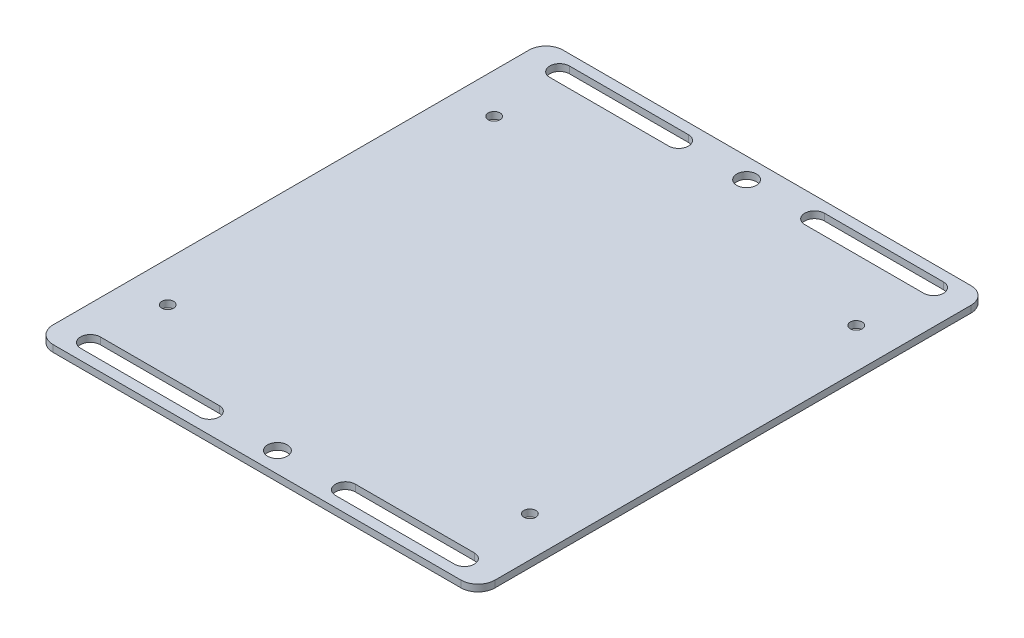
ISO-10303-21;
HEADER;
FILE_DESCRIPTION(('STEP AP214'),'2;1');
FILE_NAME('part.step','',(''),(''),'','','');
FILE_SCHEMA(('AUTOMOTIVE_DESIGN { 1 0 10303 214 1 1 1 1 }'));
ENDSEC;
DATA;
#1=APPLICATION_CONTEXT('core data for automotive mechanical design processes');
#2=APPLICATION_PROTOCOL_DEFINITION('international standard','automotive_design',2000,#1);
#3=PRODUCT_CONTEXT('',#1,'mechanical');
#4=PRODUCT('Part','Part','',(#3));
#5=PRODUCT_RELATED_PRODUCT_CATEGORY('part','',(#4));
#6=PRODUCT_DEFINITION_FORMATION('','',#4);
#7=PRODUCT_DEFINITION_CONTEXT('part definition',#1,'design');
#8=PRODUCT_DEFINITION('design','',#6,#7);
#9=PRODUCT_DEFINITION_SHAPE('','',#8);
#10=(LENGTH_UNIT() NAMED_UNIT(*) SI_UNIT(.MILLI.,.METRE.));
#11=(NAMED_UNIT(*) PLANE_ANGLE_UNIT() SI_UNIT($,.RADIAN.));
#12=(NAMED_UNIT(*) SI_UNIT($,.STERADIAN.) SOLID_ANGLE_UNIT());
#13=UNCERTAINTY_MEASURE_WITH_UNIT(LENGTH_MEASURE(1.E-05),#10,'distance_accuracy_value','');
#14=(GEOMETRIC_REPRESENTATION_CONTEXT(3) GLOBAL_UNCERTAINTY_ASSIGNED_CONTEXT((#13)) GLOBAL_UNIT_ASSIGNED_CONTEXT((#10,
#11,#12)) REPRESENTATION_CONTEXT('',''));
#15=CARTESIAN_POINT('',(0.,0.,0.));
#16=DIRECTION('',(0.,0.,1.));
#17=DIRECTION('',(1.,0.,0.));
#18=AXIS2_PLACEMENT_3D('',#15,#16,#17);
#19=CARTESIAN_POINT('',(0.,2.,0.));
#20=DIRECTION('',(0.,-1.,0.));
#21=DIRECTION('',(0.,0.,-1.));
#22=AXIS2_PLACEMENT_3D('',#19,#20,#21);
#23=PLANE('',#22);
#24=CARTESIAN_POINT('',(53.25,2.,48.));
#25=DIRECTION('',(0.,1.,0.));
#26=DIRECTION('',(0.,0.,1.));
#27=AXIS2_PLACEMENT_3D('',#24,#25,#26);
#28=CIRCLE('',#27,1.75);
#29=CARTESIAN_POINT('',(53.25,2.,49.75));
#30=VERTEX_POINT('',#29);
#31=EDGE_CURVE('E797',#30,#30,#28,.T.);
#32=ORIENTED_EDGE('',*,*,#31,.F.);
#33=EDGE_LOOP('',(#32));
#34=FACE_BOUND('',#33,.T.);
#35=CARTESIAN_POINT('',(-53.25,2.,48.));
#36=DIRECTION('',(0.,1.,0.));
#37=DIRECTION('',(0.,0.,1.));
#38=AXIS2_PLACEMENT_3D('',#35,#36,#37);
#39=CIRCLE('',#38,1.75);
#40=CARTESIAN_POINT('',(-53.25,2.,49.75));
#41=VERTEX_POINT('',#40);
#42=EDGE_CURVE('E801',#41,#41,#39,.T.);
#43=ORIENTED_EDGE('',*,*,#42,.F.);
#44=EDGE_LOOP('',(#43));
#45=FACE_BOUND('',#44,.T.);
#46=CARTESIAN_POINT('',(-53.25,2.,-48.));
#47=DIRECTION('',(0.,1.,0.));
#48=DIRECTION('',(0.,0.,1.));
#49=AXIS2_PLACEMENT_3D('',#46,#47,#48);
#50=CIRCLE('',#49,1.75);
#51=CARTESIAN_POINT('',(-53.25,2.,-46.25));
#52=VERTEX_POINT('',#51);
#53=EDGE_CURVE('E815',#52,#52,#50,.T.);
#54=ORIENTED_EDGE('',*,*,#53,.F.);
#55=EDGE_LOOP('',(#54));
#56=FACE_BOUND('',#55,.T.);
#57=CARTESIAN_POINT('',(53.25,2.,-48.));
#58=DIRECTION('',(0.,1.,0.));
#59=DIRECTION('',(0.,0.,1.));
#60=AXIS2_PLACEMENT_3D('',#57,#58,#59);
#61=CIRCLE('',#60,1.75);
#62=CARTESIAN_POINT('',(53.25,2.,-46.25));
#63=VERTEX_POINT('',#62);
#64=EDGE_CURVE('E238',#63,#63,#61,.T.);
#65=ORIENTED_EDGE('',*,*,#64,.F.);
#66=EDGE_LOOP('',(#65));
#67=FACE_BOUND('',#66,.T.);
#68=CARTESIAN_POINT('',(0.,2.,69.));
#69=DIRECTION('',(0.,-1.,0.));
#70=DIRECTION('',(0.,0.,-1.));
#71=AXIS2_PLACEMENT_3D('',#68,#69,#70);
#72=CIRCLE('',#71,2.9);
#73=CARTESIAN_POINT('',(0.,2.,66.1));
#74=VERTEX_POINT('',#73);
#75=EDGE_CURVE('E266',#74,#74,#72,.T.);
#76=ORIENTED_EDGE('',*,*,#75,.T.);
#77=EDGE_LOOP('',(#76));
#78=FACE_BOUND('',#77,.T.);
#79=CARTESIAN_POINT('',(20.,2.,69.));
#80=DIRECTION('',(0.,-1.,0.));
#81=DIRECTION('',(0.,0.,-1.));
#82=AXIS2_PLACEMENT_3D('',#79,#80,#81);
#83=CIRCLE('',#82,2.9);
#84=CARTESIAN_POINT('',(20.,2.,71.9));
#85=VERTEX_POINT('',#84);
#86=CARTESIAN_POINT('',(20.,2.,66.1));
#87=VERTEX_POINT('',#86);
#88=EDGE_CURVE('E286',#85,#87,#83,.T.);
#89=ORIENTED_EDGE('',*,*,#88,.T.);
#90=DIRECTION('',(1.,0.,0.));
#91=VECTOR('',#90,1.);
#92=CARTESIAN_POINT('',(20.,2.,66.1));
#93=LINE('',#92,#91);
#94=CARTESIAN_POINT('',(55.,2.,66.1));
#95=VERTEX_POINT('',#94);
#96=EDGE_CURVE('E275',#87,#95,#93,.T.);
#97=ORIENTED_EDGE('',*,*,#96,.T.);
#98=CARTESIAN_POINT('',(55.,2.,69.));
#99=DIRECTION('',(0.,-1.,0.));
#100=DIRECTION('',(0.,0.,-1.));
#101=AXIS2_PLACEMENT_3D('',#98,#99,#100);
#102=CIRCLE('',#101,2.9);
#103=CARTESIAN_POINT('',(55.,2.,71.9));
#104=VERTEX_POINT('',#103);
#105=EDGE_CURVE('E295',#95,#104,#102,.T.);
#106=ORIENTED_EDGE('',*,*,#105,.T.);
#107=DIRECTION('',(-1.,0.,0.));
#108=VECTOR('',#107,1.);
#109=CARTESIAN_POINT('',(20.,2.,71.9));
#110=LINE('',#109,#108);
#111=EDGE_CURVE('E290',#104,#85,#110,.T.);
#112=ORIENTED_EDGE('',*,*,#111,.T.);
#113=EDGE_LOOP('',(#89,#97,#106,#112));
#114=FACE_BOUND('',#113,.T.);
#115=DIRECTION('',(1.,0.,0.));
#116=VECTOR('',#115,1.);
#117=CARTESIAN_POINT('',(-55.,2.,-66.1));
#118=LINE('',#117,#116);
#119=CARTESIAN_POINT('',(-55.,2.,-66.1));
#120=VERTEX_POINT('',#119);
#121=CARTESIAN_POINT('',(-20.,2.,-66.1));
#122=VERTEX_POINT('',#121);
#123=EDGE_CURVE('E335',#120,#122,#118,.T.);
#124=ORIENTED_EDGE('',*,*,#123,.F.);
#125=CARTESIAN_POINT('',(-55.,2.,-69.));
#126=DIRECTION('',(0.,1.,0.));
#127=DIRECTION('',(0.,0.,1.));
#128=AXIS2_PLACEMENT_3D('',#125,#126,#127);
#129=CIRCLE('',#128,2.9);
#130=CARTESIAN_POINT('',(-55.,2.,-71.9));
#131=VERTEX_POINT('',#130);
#132=EDGE_CURVE('E332',#131,#120,#129,.T.);
#133=ORIENTED_EDGE('',*,*,#132,.F.);
#134=DIRECTION('',(-1.,0.,0.));
#135=VECTOR('',#134,1.);
#136=CARTESIAN_POINT('',(-55.,2.,-71.9));
#137=LINE('',#136,#135);
#138=CARTESIAN_POINT('',(-20.,2.,-71.9));
#139=VERTEX_POINT('',#138);
#140=EDGE_CURVE('E319',#139,#131,#137,.T.);
#141=ORIENTED_EDGE('',*,*,#140,.F.);
#142=CARTESIAN_POINT('',(-20.,2.,-69.));
#143=DIRECTION('',(0.,1.,0.));
#144=DIRECTION('',(0.,0.,1.));
#145=AXIS2_PLACEMENT_3D('',#142,#143,#144);
#146=CIRCLE('',#145,2.9);
#147=EDGE_CURVE('E340',#122,#139,#146,.T.);
#148=ORIENTED_EDGE('',*,*,#147,.F.);
#149=EDGE_LOOP('',(#124,#133,#141,#148));
#150=FACE_BOUND('',#149,.T.);
#151=CARTESIAN_POINT('',(0.,2.,-69.));
#152=DIRECTION('',(0.,1.,0.));
#153=DIRECTION('',(0.,0.,1.));
#154=AXIS2_PLACEMENT_3D('',#151,#152,#153);
#155=CIRCLE('',#154,2.9);
#156=CARTESIAN_POINT('',(0.,2.,-66.1));
#157=VERTEX_POINT('',#156);
#158=EDGE_CURVE('E363',#157,#157,#155,.T.);
#159=ORIENTED_EDGE('',*,*,#158,.F.);
#160=EDGE_LOOP('',(#159));
#161=FACE_BOUND('',#160,.T.);
#162=DIRECTION('',(1.,0.,0.));
#163=VECTOR('',#162,1.);
#164=CARTESIAN_POINT('',(20.,2.,-66.1));
#165=LINE('',#164,#163);
#166=CARTESIAN_POINT('',(20.,2.,-66.1));
#167=VERTEX_POINT('',#166);
#168=CARTESIAN_POINT('',(55.,2.,-66.1));
#169=VERTEX_POINT('',#168);
#170=EDGE_CURVE('E388',#167,#169,#165,.T.);
#171=ORIENTED_EDGE('',*,*,#170,.F.);
#172=CARTESIAN_POINT('',(20.,2.,-69.));
#173=DIRECTION('',(0.,1.,0.));
#174=DIRECTION('',(0.,0.,1.));
#175=AXIS2_PLACEMENT_3D('',#172,#173,#174);
#176=CIRCLE('',#175,2.9);
#177=CARTESIAN_POINT('',(20.,2.,-71.9));
#178=VERTEX_POINT('',#177);
#179=EDGE_CURVE('E257',#178,#167,#176,.T.);
#180=ORIENTED_EDGE('',*,*,#179,.F.);
#181=DIRECTION('',(-1.,0.,0.));
#182=VECTOR('',#181,1.);
#183=CARTESIAN_POINT('',(20.,2.,-71.9));
#184=LINE('',#183,#182);
#185=CARTESIAN_POINT('',(55.,2.,-71.9));
#186=VERTEX_POINT('',#185);
#187=EDGE_CURVE('E373',#186,#178,#184,.T.);
#188=ORIENTED_EDGE('',*,*,#187,.F.);
#189=CARTESIAN_POINT('',(55.,2.,-69.));
#190=DIRECTION('',(0.,1.,0.));
#191=DIRECTION('',(0.,0.,1.));
#192=AXIS2_PLACEMENT_3D('',#189,#190,#191);
#193=CIRCLE('',#192,2.9);
#194=EDGE_CURVE('E392',#169,#186,#193,.T.);
#195=ORIENTED_EDGE('',*,*,#194,.F.);
#196=EDGE_LOOP('',(#171,#180,#188,#195));
#197=FACE_BOUND('',#196,.T.);
#198=DIRECTION('',(1.,0.,0.));
#199=VECTOR('',#198,1.);
#200=CARTESIAN_POINT('',(-65.,2.,75.));
#201=LINE('',#200,#199);
#202=CARTESIAN_POINT('',(-60.,2.,75.));
#203=VERTEX_POINT('',#202);
#204=CARTESIAN_POINT('',(60.,2.,75.));
#205=VERTEX_POINT('',#204);
#206=EDGE_CURVE('E421',#203,#205,#201,.T.);
#207=ORIENTED_EDGE('',*,*,#206,.T.);
#208=CARTESIAN_POINT('',(60.,2.,70.));
#209=DIRECTION('',(0.,-1.,0.));
#210=DIRECTION('',(0.,0.,-1.));
#211=AXIS2_PLACEMENT_3D('',#208,#209,#210);
#212=CIRCLE('',#211,5.);
#213=CARTESIAN_POINT('',(65.,2.,70.));
#214=VERTEX_POINT('',#213);
#215=EDGE_CURVE('E472',#205,#214,#212,.F.);
#216=ORIENTED_EDGE('',*,*,#215,.T.);
#217=DIRECTION('',(0.,0.,-1.));
#218=VECTOR('',#217,1.);
#219=CARTESIAN_POINT('',(65.,2.,75.));
#220=LINE('',#219,#218);
#221=CARTESIAN_POINT('',(65.,2.,-70.));
#222=VERTEX_POINT('',#221);
#223=EDGE_CURVE('E410',#214,#222,#220,.T.);
#224=ORIENTED_EDGE('',*,*,#223,.T.);
#225=CARTESIAN_POINT('',(60.,2.,-70.));
#226=DIRECTION('',(0.,-1.,0.));
#227=DIRECTION('',(0.,0.,-1.));
#228=AXIS2_PLACEMENT_3D('',#225,#226,#227);
#229=CIRCLE('',#228,5.);
#230=CARTESIAN_POINT('',(60.,2.,-75.));
#231=VERTEX_POINT('',#230);
#232=EDGE_CURVE('E464',#222,#231,#229,.F.);
#233=ORIENTED_EDGE('',*,*,#232,.T.);
#234=DIRECTION('',(-1.,0.,0.));
#235=VECTOR('',#234,1.);
#236=CARTESIAN_POINT('',(-65.,2.,-75.));
#237=LINE('',#236,#235);
#238=CARTESIAN_POINT('',(-60.,2.,-75.));
#239=VERTEX_POINT('',#238);
#240=EDGE_CURVE('E414',#231,#239,#237,.T.);
#241=ORIENTED_EDGE('',*,*,#240,.T.);
#242=CARTESIAN_POINT('',(-60.,2.,-70.));
#243=DIRECTION('',(0.,-1.,0.));
#244=DIRECTION('',(0.,0.,-1.));
#245=AXIS2_PLACEMENT_3D('',#242,#243,#244);
#246=CIRCLE('',#245,5.);
#247=CARTESIAN_POINT('',(-65.,2.,-70.));
#248=VERTEX_POINT('',#247);
#249=EDGE_CURVE('E64',#239,#248,#246,.F.);
#250=ORIENTED_EDGE('',*,*,#249,.T.);
#251=DIRECTION('',(0.,0.,1.));
#252=VECTOR('',#251,1.);
#253=CARTESIAN_POINT('',(-65.,2.,75.));
#254=LINE('',#253,#252);
#255=CARTESIAN_POINT('',(-65.,2.,70.));
#256=VERTEX_POINT('',#255);
#257=EDGE_CURVE('E418',#248,#256,#254,.T.);
#258=ORIENTED_EDGE('',*,*,#257,.T.);
#259=CARTESIAN_POINT('',(-60.,2.,70.));
#260=DIRECTION('',(0.,-1.,0.));
#261=DIRECTION('',(0.,0.,-1.));
#262=AXIS2_PLACEMENT_3D('',#259,#260,#261);
#263=CIRCLE('',#262,5.);
#264=EDGE_CURVE('E469',#256,#203,#263,.F.);
#265=ORIENTED_EDGE('',*,*,#264,.T.);
#266=EDGE_LOOP('',(#207,#216,#224,#233,#241,#250,#258,#265));
#267=FACE_BOUND('',#266,.T.);
#268=CARTESIAN_POINT('',(-55.,2.,69.));
#269=DIRECTION('',(0.,-1.,0.));
#270=DIRECTION('',(0.,0.,-1.));
#271=AXIS2_PLACEMENT_3D('',#268,#269,#270);
#272=CIRCLE('',#271,2.9);
#273=CARTESIAN_POINT('',(-55.,2.,71.9));
#274=VERTEX_POINT('',#273);
#275=CARTESIAN_POINT('',(-55.,2.,66.1));
#276=VERTEX_POINT('',#275);
#277=EDGE_CURVE('E224',#274,#276,#272,.T.);
#278=ORIENTED_EDGE('',*,*,#277,.T.);
#279=DIRECTION('',(1.,0.,0.));
#280=VECTOR('',#279,1.);
#281=CARTESIAN_POINT('',(-55.,2.,66.1));
#282=LINE('',#281,#280);
#283=CARTESIAN_POINT('',(-20.,2.,66.1));
#284=VERTEX_POINT('',#283);
#285=EDGE_CURVE('E231',#276,#284,#282,.T.);
#286=ORIENTED_EDGE('',*,*,#285,.T.);
#287=CARTESIAN_POINT('',(-20.,2.,69.));
#288=DIRECTION('',(0.,-1.,0.));
#289=DIRECTION('',(0.,0.,-1.));
#290=AXIS2_PLACEMENT_3D('',#287,#288,#289);
#291=CIRCLE('',#290,2.9);
#292=CARTESIAN_POINT('',(-20.,2.,71.9));
#293=VERTEX_POINT('',#292);
#294=EDGE_CURVE('E235',#284,#293,#291,.T.);
#295=ORIENTED_EDGE('',*,*,#294,.T.);
#296=DIRECTION('',(-1.,0.,0.));
#297=VECTOR('',#296,1.);
#298=CARTESIAN_POINT('',(-55.,2.,71.9));
#299=LINE('',#298,#297);
#300=EDGE_CURVE('E247',#293,#274,#299,.T.);
#301=ORIENTED_EDGE('',*,*,#300,.T.);
#302=EDGE_LOOP('',(#278,#286,#295,#301));
#303=FACE_BOUND('',#302,.T.);
#304=ADVANCED_FACE('F41',(#34,#45,#56,#67,#78,#114,#150,#161,#197,#267,#303),#23,.F.);
#305=CARTESIAN_POINT('',(0.,0.,0.));
#306=DIRECTION('',(0.,-1.,0.));
#307=DIRECTION('',(0.,0.,-1.));
#308=AXIS2_PLACEMENT_3D('',#305,#306,#307);
#309=PLANE('',#308);
#310=CARTESIAN_POINT('',(53.25,0.,48.));
#311=DIRECTION('',(0.,1.,0.));
#312=DIRECTION('',(0.,0.,1.));
#313=AXIS2_PLACEMENT_3D('',#310,#311,#312);
#314=CIRCLE('',#313,1.75);
#315=CARTESIAN_POINT('',(53.25,0.,49.75));
#316=VERTEX_POINT('',#315);
#317=EDGE_CURVE('E795',#316,#316,#314,.T.);
#318=ORIENTED_EDGE('',*,*,#317,.T.);
#319=EDGE_LOOP('',(#318));
#320=FACE_BOUND('',#319,.T.);
#321=CARTESIAN_POINT('',(-53.25,0.,48.));
#322=DIRECTION('',(0.,1.,0.));
#323=DIRECTION('',(0.,0.,1.));
#324=AXIS2_PLACEMENT_3D('',#321,#322,#323);
#325=CIRCLE('',#324,1.75);
#326=CARTESIAN_POINT('',(-53.25,0.,49.75));
#327=VERTEX_POINT('',#326);
#328=EDGE_CURVE('E821',#327,#327,#325,.T.);
#329=ORIENTED_EDGE('',*,*,#328,.T.);
#330=EDGE_LOOP('',(#329));
#331=FACE_BOUND('',#330,.T.);
#332=CARTESIAN_POINT('',(-53.25,0.,-48.));
#333=DIRECTION('',(0.,1.,0.));
#334=DIRECTION('',(0.,0.,1.));
#335=AXIS2_PLACEMENT_3D('',#332,#333,#334);
#336=CIRCLE('',#335,1.75);
#337=CARTESIAN_POINT('',(-53.25,0.,-46.25));
#338=VERTEX_POINT('',#337);
#339=EDGE_CURVE('E810',#338,#338,#336,.T.);
#340=ORIENTED_EDGE('',*,*,#339,.T.);
#341=EDGE_LOOP('',(#340));
#342=FACE_BOUND('',#341,.T.);
#343=CARTESIAN_POINT('',(53.25,0.,-48.));
#344=DIRECTION('',(0.,1.,0.));
#345=DIRECTION('',(0.,0.,1.));
#346=AXIS2_PLACEMENT_3D('',#343,#344,#345);
#347=CIRCLE('',#346,1.75);
#348=CARTESIAN_POINT('',(53.25,0.,-46.25));
#349=VERTEX_POINT('',#348);
#350=EDGE_CURVE('E291',#349,#349,#347,.T.);
#351=ORIENTED_EDGE('',*,*,#350,.T.);
#352=EDGE_LOOP('',(#351));
#353=FACE_BOUND('',#352,.T.);
#354=DIRECTION('',(1.,0.,0.));
#355=VECTOR('',#354,1.);
#356=CARTESIAN_POINT('',(20.,0.,66.1));
#357=LINE('',#356,#355);
#358=CARTESIAN_POINT('',(20.,0.,66.1));
#359=VERTEX_POINT('',#358);
#360=CARTESIAN_POINT('',(55.,0.,66.1));
#361=VERTEX_POINT('',#360);
#362=EDGE_CURVE('E282',#359,#361,#357,.T.);
#363=ORIENTED_EDGE('',*,*,#362,.F.);
#364=CARTESIAN_POINT('',(20.,0.,69.));
#365=DIRECTION('',(0.,-1.,0.));
#366=DIRECTION('',(0.,0.,-1.));
#367=AXIS2_PLACEMENT_3D('',#364,#365,#366);
#368=CIRCLE('',#367,2.9);
#369=CARTESIAN_POINT('',(20.,0.,71.9));
#370=VERTEX_POINT('',#369);
#371=EDGE_CURVE('E271',#370,#359,#368,.T.);
#372=ORIENTED_EDGE('',*,*,#371,.F.);
#373=DIRECTION('',(-1.,0.,0.));
#374=VECTOR('',#373,1.);
#375=CARTESIAN_POINT('',(20.,0.,71.9));
#376=LINE('',#375,#374);
#377=CARTESIAN_POINT('',(55.,0.,71.9));
#378=VERTEX_POINT('',#377);
#379=EDGE_CURVE('E274',#378,#370,#376,.T.);
#380=ORIENTED_EDGE('',*,*,#379,.F.);
#381=CARTESIAN_POINT('',(55.,0.,69.));
#382=DIRECTION('',(0.,-1.,0.));
#383=DIRECTION('',(0.,0.,-1.));
#384=AXIS2_PLACEMENT_3D('',#381,#382,#383);
#385=CIRCLE('',#384,2.9);
#386=EDGE_CURVE('E278',#361,#378,#385,.T.);
#387=ORIENTED_EDGE('',*,*,#386,.F.);
#388=EDGE_LOOP('',(#363,#372,#380,#387));
#389=FACE_BOUND('',#388,.T.);
#390=DIRECTION('',(0.,0.,-1.));
#391=VECTOR('',#390,1.);
#392=CARTESIAN_POINT('',(65.,0.,75.));
#393=LINE('',#392,#391);
#394=CARTESIAN_POINT('',(65.,0.,70.));
#395=VERTEX_POINT('',#394);
#396=CARTESIAN_POINT('',(65.,0.,-70.));
#397=VERTEX_POINT('',#396);
#398=EDGE_CURVE('E350',#395,#397,#393,.T.);
#399=ORIENTED_EDGE('',*,*,#398,.F.);
#400=CARTESIAN_POINT('',(60.,0.,70.));
#401=DIRECTION('',(0.,-1.,0.));
#402=DIRECTION('',(0.,0.,-1.));
#403=AXIS2_PLACEMENT_3D('',#400,#401,#402);
#404=CIRCLE('',#403,5.);
#405=CARTESIAN_POINT('',(60.,0.,75.));
#406=VERTEX_POINT('',#405);
#407=EDGE_CURVE('E454',#395,#406,#404,.T.);
#408=ORIENTED_EDGE('',*,*,#407,.T.);
#409=DIRECTION('',(1.,0.,0.));
#410=VECTOR('',#409,1.);
#411=CARTESIAN_POINT('',(-65.,0.,75.));
#412=LINE('',#411,#410);
#413=CARTESIAN_POINT('',(-60.,0.,75.));
#414=VERTEX_POINT('',#413);
#415=EDGE_CURVE('E415',#414,#406,#412,.T.);
#416=ORIENTED_EDGE('',*,*,#415,.F.);
#417=CARTESIAN_POINT('',(-60.,0.,70.));
#418=DIRECTION('',(0.,-1.,0.));
#419=DIRECTION('',(0.,0.,-1.));
#420=AXIS2_PLACEMENT_3D('',#417,#418,#419);
#421=CIRCLE('',#420,5.);
#422=CARTESIAN_POINT('',(-65.,0.,70.));
#423=VERTEX_POINT('',#422);
#424=EDGE_CURVE('E451',#414,#423,#421,.T.);
#425=ORIENTED_EDGE('',*,*,#424,.T.);
#426=DIRECTION('',(0.,0.,1.));
#427=VECTOR('',#426,1.);
#428=CARTESIAN_POINT('',(-65.,0.,75.));
#429=LINE('',#428,#427);
#430=CARTESIAN_POINT('',(-65.,0.,-70.));
#431=VERTEX_POINT('',#430);
#432=EDGE_CURVE('E433',#431,#423,#429,.T.);
#433=ORIENTED_EDGE('',*,*,#432,.F.);
#434=CARTESIAN_POINT('',(-60.,0.,-70.));
#435=DIRECTION('',(0.,-1.,0.));
#436=DIRECTION('',(0.,0.,-1.));
#437=AXIS2_PLACEMENT_3D('',#434,#435,#436);
#438=CIRCLE('',#437,5.);
#439=CARTESIAN_POINT('',(-60.,0.,-75.));
#440=VERTEX_POINT('',#439);
#441=EDGE_CURVE('E448',#431,#440,#438,.T.);
#442=ORIENTED_EDGE('',*,*,#441,.T.);
#443=DIRECTION('',(-1.,0.,0.));
#444=VECTOR('',#443,1.);
#445=CARTESIAN_POINT('',(-65.,0.,-75.));
#446=LINE('',#445,#444);
#447=CARTESIAN_POINT('',(60.,0.,-75.));
#448=VERTEX_POINT('',#447);
#449=EDGE_CURVE('E429',#448,#440,#446,.T.);
#450=ORIENTED_EDGE('',*,*,#449,.F.);
#451=CARTESIAN_POINT('',(60.,0.,-70.));
#452=DIRECTION('',(0.,-1.,0.));
#453=DIRECTION('',(0.,0.,-1.));
#454=AXIS2_PLACEMENT_3D('',#451,#452,#453);
#455=CIRCLE('',#454,5.);
#456=EDGE_CURVE('E445',#448,#397,#455,.T.);
#457=ORIENTED_EDGE('',*,*,#456,.T.);
#458=EDGE_LOOP('',(#399,#408,#416,#425,#433,#442,#450,#457));
#459=FACE_BOUND('',#458,.T.);
#460=CARTESIAN_POINT('',(20.,0.,-69.));
#461=DIRECTION('',(0.,1.,0.));
#462=DIRECTION('',(0.,0.,1.));
#463=AXIS2_PLACEMENT_3D('',#460,#461,#462);
#464=CIRCLE('',#463,2.9);
#465=CARTESIAN_POINT('',(20.,0.,-71.9));
#466=VERTEX_POINT('',#465);
#467=CARTESIAN_POINT('',(20.,0.,-66.1));
#468=VERTEX_POINT('',#467);
#469=EDGE_CURVE('E368',#466,#468,#464,.T.);
#470=ORIENTED_EDGE('',*,*,#469,.T.);
#471=DIRECTION('',(1.,0.,0.));
#472=VECTOR('',#471,1.);
#473=CARTESIAN_POINT('',(20.,0.,-66.1));
#474=LINE('',#473,#472);
#475=CARTESIAN_POINT('',(55.,0.,-66.1));
#476=VERTEX_POINT('',#475);
#477=EDGE_CURVE('E372',#468,#476,#474,.T.);
#478=ORIENTED_EDGE('',*,*,#477,.T.);
#479=CARTESIAN_POINT('',(55.,0.,-69.));
#480=DIRECTION('',(0.,1.,0.));
#481=DIRECTION('',(0.,0.,1.));
#482=AXIS2_PLACEMENT_3D('',#479,#480,#481);
#483=CIRCLE('',#482,2.9);
#484=CARTESIAN_POINT('',(55.,0.,-71.9));
#485=VERTEX_POINT('',#484);
#486=EDGE_CURVE('E377',#476,#485,#483,.T.);
#487=ORIENTED_EDGE('',*,*,#486,.T.);
#488=DIRECTION('',(-1.,0.,0.));
#489=VECTOR('',#488,1.);
#490=CARTESIAN_POINT('',(20.,0.,-71.9));
#491=LINE('',#490,#489);
#492=EDGE_CURVE('E381',#485,#466,#491,.T.);
#493=ORIENTED_EDGE('',*,*,#492,.T.);
#494=EDGE_LOOP('',(#470,#478,#487,#493));
#495=FACE_BOUND('',#494,.T.);
#496=CARTESIAN_POINT('',(0.,0.,-69.));
#497=DIRECTION('',(0.,1.,0.));
#498=DIRECTION('',(0.,0.,1.));
#499=AXIS2_PLACEMENT_3D('',#496,#497,#498);
#500=CIRCLE('',#499,2.9);
#501=CARTESIAN_POINT('',(0.,0.,-66.1));
#502=VERTEX_POINT('',#501);
#503=EDGE_CURVE('E336',#502,#502,#500,.T.);
#504=ORIENTED_EDGE('',*,*,#503,.T.);
#505=EDGE_LOOP('',(#504));
#506=FACE_BOUND('',#505,.T.);
#507=CARTESIAN_POINT('',(-55.,0.,-69.));
#508=DIRECTION('',(0.,1.,0.));
#509=DIRECTION('',(0.,0.,1.));
#510=AXIS2_PLACEMENT_3D('',#507,#508,#509);
#511=CIRCLE('',#510,2.9);
#512=CARTESIAN_POINT('',(-55.,0.,-71.9));
#513=VERTEX_POINT('',#512);
#514=CARTESIAN_POINT('',(-55.,0.,-66.1));
#515=VERTEX_POINT('',#514);
#516=EDGE_CURVE('E314',#513,#515,#511,.T.);
#517=ORIENTED_EDGE('',*,*,#516,.T.);
#518=DIRECTION('',(1.,0.,0.));
#519=VECTOR('',#518,1.);
#520=CARTESIAN_POINT('',(-55.,0.,-66.1));
#521=LINE('',#520,#519);
#522=CARTESIAN_POINT('',(-20.,0.,-66.1));
#523=VERTEX_POINT('',#522);
#524=EDGE_CURVE('E318',#515,#523,#521,.T.);
#525=ORIENTED_EDGE('',*,*,#524,.T.);
#526=CARTESIAN_POINT('',(-20.,0.,-69.));
#527=DIRECTION('',(0.,1.,0.));
#528=DIRECTION('',(0.,0.,1.));
#529=AXIS2_PLACEMENT_3D('',#526,#527,#528);
#530=CIRCLE('',#529,2.9);
#531=CARTESIAN_POINT('',(-20.,0.,-71.9));
#532=VERTEX_POINT('',#531);
#533=EDGE_CURVE('E323',#523,#532,#530,.T.);
#534=ORIENTED_EDGE('',*,*,#533,.T.);
#535=DIRECTION('',(-1.,0.,0.));
#536=VECTOR('',#535,1.);
#537=CARTESIAN_POINT('',(-55.,0.,-71.9));
#538=LINE('',#537,#536);
#539=EDGE_CURVE('E327',#532,#513,#538,.T.);
#540=ORIENTED_EDGE('',*,*,#539,.T.);
#541=EDGE_LOOP('',(#517,#525,#534,#540));
#542=FACE_BOUND('',#541,.T.);
#543=CARTESIAN_POINT('',(0.,0.,69.));
#544=DIRECTION('',(0.,-1.,0.));
#545=DIRECTION('',(0.,0.,-1.));
#546=AXIS2_PLACEMENT_3D('',#543,#544,#545);
#547=CIRCLE('',#546,2.9);
#548=CARTESIAN_POINT('',(0.,0.,66.1));
#549=VERTEX_POINT('',#548);
#550=EDGE_CURVE('E248',#549,#549,#547,.T.);
#551=ORIENTED_EDGE('',*,*,#550,.F.);
#552=EDGE_LOOP('',(#551));
#553=FACE_BOUND('',#552,.T.);
#554=DIRECTION('',(1.,0.,0.));
#555=VECTOR('',#554,1.);
#556=CARTESIAN_POINT('',(-55.,0.,66.1));
#557=LINE('',#556,#555);
#558=CARTESIAN_POINT('',(-55.,0.,66.1));
#559=VERTEX_POINT('',#558);
#560=CARTESIAN_POINT('',(-20.,0.,66.1));
#561=VERTEX_POINT('',#560);
#562=EDGE_CURVE('E226',#559,#561,#557,.T.);
#563=ORIENTED_EDGE('',*,*,#562,.F.);
#564=CARTESIAN_POINT('',(-55.,0.,69.));
#565=DIRECTION('',(0.,-1.,0.));
#566=DIRECTION('',(0.,0.,-1.));
#567=AXIS2_PLACEMENT_3D('',#564,#565,#566);
#568=CIRCLE('',#567,2.9);
#569=CARTESIAN_POINT('',(-55.,0.,71.9));
#570=VERTEX_POINT('',#569);
#571=EDGE_CURVE('E217',#570,#559,#568,.T.);
#572=ORIENTED_EDGE('',*,*,#571,.F.);
#573=DIRECTION('',(-1.,0.,0.));
#574=VECTOR('',#573,1.);
#575=CARTESIAN_POINT('',(-55.,0.,71.9));
#576=LINE('',#575,#574);
#577=CARTESIAN_POINT('',(-20.,0.,71.9));
#578=VERTEX_POINT('',#577);
#579=EDGE_CURVE('E204',#578,#570,#576,.T.);
#580=ORIENTED_EDGE('',*,*,#579,.F.);
#581=CARTESIAN_POINT('',(-20.,0.,69.));
#582=DIRECTION('',(0.,-1.,0.));
#583=DIRECTION('',(0.,0.,-1.));
#584=AXIS2_PLACEMENT_3D('',#581,#582,#583);
#585=CIRCLE('',#584,2.9);
#586=EDGE_CURVE('E216',#561,#578,#585,.T.);
#587=ORIENTED_EDGE('',*,*,#586,.F.);
#588=EDGE_LOOP('',(#563,#572,#580,#587));
#589=FACE_BOUND('',#588,.T.);
#590=ADVANCED_FACE('F229',(#320,#331,#342,#353,#389,#459,#495,#506,#542,#553,#589),#309,.T.);
#591=CARTESIAN_POINT('',(65.,2.,75.));
#592=DIRECTION('',(-1.,0.,0.));
#593=DIRECTION('',(0.,0.,1.));
#594=AXIS2_PLACEMENT_3D('',#591,#592,#593);
#595=PLANE('',#594);
#596=ORIENTED_EDGE('',*,*,#223,.F.);
#597=DIRECTION('',(0.,-1.,0.));
#598=VECTOR('',#597,1.);
#599=CARTESIAN_POINT('',(65.,2.,70.));
#600=LINE('',#599,#598);
#601=EDGE_CURVE('E441',#214,#395,#600,.T.);
#602=ORIENTED_EDGE('',*,*,#601,.T.);
#603=ORIENTED_EDGE('',*,*,#398,.T.);
#604=DIRECTION('',(0.,-1.,0.));
#605=VECTOR('',#604,1.);
#606=CARTESIAN_POINT('',(65.,2.,-70.));
#607=LINE('',#606,#605);
#608=EDGE_CURVE('E425',#397,#222,#607,.F.);
#609=ORIENTED_EDGE('',*,*,#608,.T.);
#610=EDGE_LOOP('',(#596,#602,#603,#609));
#611=FACE_BOUND('',#610,.T.);
#612=ADVANCED_FACE('F514',(#611),#595,.F.);
#613=CARTESIAN_POINT('',(-65.,2.,-75.));
#614=DIRECTION('',(0.,0.,1.));
#615=DIRECTION('',(1.,0.,0.));
#616=AXIS2_PLACEMENT_3D('',#613,#614,#615);
#617=PLANE('',#616);
#618=ORIENTED_EDGE('',*,*,#449,.T.);
#619=DIRECTION('',(0.,-1.,0.));
#620=VECTOR('',#619,1.);
#621=CARTESIAN_POINT('',(-60.,2.,-75.));
#622=LINE('',#621,#620);
#623=EDGE_CURVE('E11',#440,#239,#622,.F.);
#624=ORIENTED_EDGE('',*,*,#623,.T.);
#625=ORIENTED_EDGE('',*,*,#240,.F.);
#626=DIRECTION('',(0.,-1.,0.));
#627=VECTOR('',#626,1.);
#628=CARTESIAN_POINT('',(60.,2.,-75.));
#629=LINE('',#628,#627);
#630=EDGE_CURVE('E50',#231,#448,#629,.T.);
#631=ORIENTED_EDGE('',*,*,#630,.T.);
#632=EDGE_LOOP('',(#618,#624,#625,#631));
#633=FACE_BOUND('',#632,.T.);
#634=ADVANCED_FACE('F486',(#633),#617,.F.);
#635=CARTESIAN_POINT('',(-65.,2.,75.));
#636=DIRECTION('',(1.,0.,0.));
#637=DIRECTION('',(0.,0.,-1.));
#638=AXIS2_PLACEMENT_3D('',#635,#636,#637);
#639=PLANE('',#638);
#640=ORIENTED_EDGE('',*,*,#432,.T.);
#641=DIRECTION('',(0.,-1.,0.));
#642=VECTOR('',#641,1.);
#643=CARTESIAN_POINT('',(-65.,2.,70.));
#644=LINE('',#643,#642);
#645=EDGE_CURVE('E57',#423,#256,#644,.F.);
#646=ORIENTED_EDGE('',*,*,#645,.T.);
#647=ORIENTED_EDGE('',*,*,#257,.F.);
#648=DIRECTION('',(0.,-1.,0.));
#649=VECTOR('',#648,1.);
#650=CARTESIAN_POINT('',(-65.,2.,-70.));
#651=LINE('',#650,#649);
#652=EDGE_CURVE('E475',#248,#431,#651,.T.);
#653=ORIENTED_EDGE('',*,*,#652,.T.);
#654=EDGE_LOOP('',(#640,#646,#647,#653));
#655=FACE_BOUND('',#654,.T.);
#656=ADVANCED_FACE('F497',(#655),#639,.F.);
#657=CARTESIAN_POINT('',(-65.,2.,75.));
#658=DIRECTION('',(0.,0.,-1.));
#659=DIRECTION('',(-1.,0.,0.));
#660=AXIS2_PLACEMENT_3D('',#657,#658,#659);
#661=PLANE('',#660);
#662=ORIENTED_EDGE('',*,*,#415,.T.);
#663=DIRECTION('',(0.,-1.,0.));
#664=VECTOR('',#663,1.);
#665=CARTESIAN_POINT('',(60.,2.,75.));
#666=LINE('',#665,#664);
#667=EDGE_CURVE('E461',#406,#205,#666,.F.);
#668=ORIENTED_EDGE('',*,*,#667,.T.);
#669=ORIENTED_EDGE('',*,*,#206,.F.);
#670=DIRECTION('',(0.,-1.,0.));
#671=VECTOR('',#670,1.);
#672=CARTESIAN_POINT('',(-60.,2.,75.));
#673=LINE('',#672,#671);
#674=EDGE_CURVE('E457',#203,#414,#673,.T.);
#675=ORIENTED_EDGE('',*,*,#674,.T.);
#676=EDGE_LOOP('',(#662,#668,#669,#675));
#677=FACE_BOUND('',#676,.T.);
#678=ADVANCED_FACE('F506',(#677),#661,.F.);
#679=CARTESIAN_POINT('',(20.,0.,-69.));
#680=DIRECTION('',(0.,1.,0.));
#681=DIRECTION('',(0.,0.,1.));
#682=AXIS2_PLACEMENT_3D('',#679,#680,#681);
#683=CYLINDRICAL_SURFACE('',#682,2.9);
#684=ORIENTED_EDGE('',*,*,#179,.T.);
#685=DIRECTION('',(0.,1.,0.));
#686=VECTOR('',#685,1.);
#687=CARTESIAN_POINT('',(20.,0.,-66.1));
#688=LINE('',#687,#686);
#689=EDGE_CURVE('E385',#468,#167,#688,.T.);
#690=ORIENTED_EDGE('',*,*,#689,.F.);
#691=ORIENTED_EDGE('',*,*,#469,.F.);
#692=DIRECTION('',(0.,1.,0.));
#693=VECTOR('',#692,1.);
#694=CARTESIAN_POINT('',(20.,0.,-71.9));
#695=LINE('',#694,#693);
#696=EDGE_CURVE('E367',#466,#178,#695,.T.);
#697=ORIENTED_EDGE('',*,*,#696,.T.);
#698=EDGE_LOOP('',(#684,#690,#691,#697));
#699=FACE_BOUND('',#698,.T.);
#700=ADVANCED_FACE('F536',(#699),#683,.F.);
#701=CARTESIAN_POINT('',(20.,0.,-71.9));
#702=DIRECTION('',(0.,0.,-1.));
#703=DIRECTION('',(-1.,0.,0.));
#704=AXIS2_PLACEMENT_3D('',#701,#702,#703);
#705=PLANE('',#704);
#706=ORIENTED_EDGE('',*,*,#187,.T.);
#707=ORIENTED_EDGE('',*,*,#696,.F.);
#708=ORIENTED_EDGE('',*,*,#492,.F.);
#709=DIRECTION('',(0.,1.,0.));
#710=VECTOR('',#709,1.);
#711=CARTESIAN_POINT('',(55.,0.,-71.9));
#712=LINE('',#711,#710);
#713=EDGE_CURVE('E401',#485,#186,#712,.T.);
#714=ORIENTED_EDGE('',*,*,#713,.T.);
#715=EDGE_LOOP('',(#706,#707,#708,#714));
#716=FACE_BOUND('',#715,.T.);
#717=ADVANCED_FACE('F645',(#716),#705,.F.);
#718=CARTESIAN_POINT('',(55.,0.,-69.));
#719=DIRECTION('',(0.,1.,0.));
#720=DIRECTION('',(0.,0.,1.));
#721=AXIS2_PLACEMENT_3D('',#718,#719,#720);
#722=CYLINDRICAL_SURFACE('',#721,2.9);
#723=ORIENTED_EDGE('',*,*,#194,.T.);
#724=ORIENTED_EDGE('',*,*,#713,.F.);
#725=ORIENTED_EDGE('',*,*,#486,.F.);
#726=DIRECTION('',(0.,1.,0.));
#727=VECTOR('',#726,1.);
#728=CARTESIAN_POINT('',(55.,0.,-66.1));
#729=LINE('',#728,#727);
#730=EDGE_CURVE('E404',#476,#169,#729,.T.);
#731=ORIENTED_EDGE('',*,*,#730,.T.);
#732=EDGE_LOOP('',(#723,#724,#725,#731));
#733=FACE_BOUND('',#732,.T.);
#734=ADVANCED_FACE('F648',(#733),#722,.F.);
#735=CARTESIAN_POINT('',(20.,0.,-66.1));
#736=DIRECTION('',(0.,0.,1.));
#737=DIRECTION('',(1.,0.,0.));
#738=AXIS2_PLACEMENT_3D('',#735,#736,#737);
#739=PLANE('',#738);
#740=ORIENTED_EDGE('',*,*,#170,.T.);
#741=ORIENTED_EDGE('',*,*,#730,.F.);
#742=ORIENTED_EDGE('',*,*,#477,.F.);
#743=ORIENTED_EDGE('',*,*,#689,.T.);
#744=EDGE_LOOP('',(#740,#741,#742,#743));
#745=FACE_BOUND('',#744,.T.);
#746=ADVANCED_FACE('F643',(#745),#739,.F.);
#747=CARTESIAN_POINT('',(0.,0.,-69.));
#748=DIRECTION('',(0.,1.,0.));
#749=DIRECTION('',(0.,0.,1.));
#750=AXIS2_PLACEMENT_3D('',#747,#748,#749);
#751=CYLINDRICAL_SURFACE('',#750,2.9);
#752=ORIENTED_EDGE('',*,*,#503,.F.);
#753=EDGE_LOOP('',(#752));
#754=FACE_BOUND('',#753,.T.);
#755=ORIENTED_EDGE('',*,*,#158,.T.);
#756=EDGE_LOOP('',(#755));
#757=FACE_BOUND('',#756,.T.);
#758=ADVANCED_FACE('F639',(#754,#757),#751,.F.);
#759=CARTESIAN_POINT('',(-55.,0.,-69.));
#760=DIRECTION('',(0.,1.,0.));
#761=DIRECTION('',(0.,0.,1.));
#762=AXIS2_PLACEMENT_3D('',#759,#760,#761);
#763=CYLINDRICAL_SURFACE('',#762,2.9);
#764=ORIENTED_EDGE('',*,*,#132,.T.);
#765=DIRECTION('',(0.,1.,0.));
#766=VECTOR('',#765,1.);
#767=CARTESIAN_POINT('',(-55.,0.,-66.1));
#768=LINE('',#767,#766);
#769=EDGE_CURVE('E331',#515,#120,#768,.T.);
#770=ORIENTED_EDGE('',*,*,#769,.F.);
#771=ORIENTED_EDGE('',*,*,#516,.F.);
#772=DIRECTION('',(0.,1.,0.));
#773=VECTOR('',#772,1.);
#774=CARTESIAN_POINT('',(-55.,0.,-71.9));
#775=LINE('',#774,#773);
#776=EDGE_CURVE('E347',#513,#131,#775,.T.);
#777=ORIENTED_EDGE('',*,*,#776,.T.);
#778=EDGE_LOOP('',(#764,#770,#771,#777));
#779=FACE_BOUND('',#778,.T.);
#780=ADVANCED_FACE('F629',(#779),#763,.F.);
#781=CARTESIAN_POINT('',(-55.,0.,-71.9));
#782=DIRECTION('',(0.,0.,-1.));
#783=DIRECTION('',(-1.,0.,0.));
#784=AXIS2_PLACEMENT_3D('',#781,#782,#783);
#785=PLANE('',#784);
#786=ORIENTED_EDGE('',*,*,#140,.T.);
#787=ORIENTED_EDGE('',*,*,#776,.F.);
#788=ORIENTED_EDGE('',*,*,#539,.F.);
#789=DIRECTION('',(0.,1.,0.));
#790=VECTOR('',#789,1.);
#791=CARTESIAN_POINT('',(-20.,0.,-71.9));
#792=LINE('',#791,#790);
#793=EDGE_CURVE('E351',#532,#139,#792,.T.);
#794=ORIENTED_EDGE('',*,*,#793,.T.);
#795=EDGE_LOOP('',(#786,#787,#788,#794));
#796=FACE_BOUND('',#795,.T.);
#797=ADVANCED_FACE('F625',(#796),#785,.F.);
#798=CARTESIAN_POINT('',(-20.,0.,-69.));
#799=DIRECTION('',(0.,1.,0.));
#800=DIRECTION('',(0.,0.,1.));
#801=AXIS2_PLACEMENT_3D('',#798,#799,#800);
#802=CYLINDRICAL_SURFACE('',#801,2.9);
#803=ORIENTED_EDGE('',*,*,#147,.T.);
#804=ORIENTED_EDGE('',*,*,#793,.F.);
#805=ORIENTED_EDGE('',*,*,#533,.F.);
#806=DIRECTION('',(0.,1.,0.));
#807=VECTOR('',#806,1.);
#808=CARTESIAN_POINT('',(-20.,0.,-66.1));
#809=LINE('',#808,#807);
#810=EDGE_CURVE('E354',#523,#122,#809,.T.);
#811=ORIENTED_EDGE('',*,*,#810,.T.);
#812=EDGE_LOOP('',(#803,#804,#805,#811));
#813=FACE_BOUND('',#812,.T.);
#814=ADVANCED_FACE('F628',(#813),#802,.F.);
#815=CARTESIAN_POINT('',(-55.,0.,-66.1));
#816=DIRECTION('',(0.,0.,1.));
#817=DIRECTION('',(1.,0.,0.));
#818=AXIS2_PLACEMENT_3D('',#815,#816,#817);
#819=PLANE('',#818);
#820=ORIENTED_EDGE('',*,*,#123,.T.);
#821=ORIENTED_EDGE('',*,*,#810,.F.);
#822=ORIENTED_EDGE('',*,*,#524,.F.);
#823=ORIENTED_EDGE('',*,*,#769,.T.);
#824=EDGE_LOOP('',(#820,#821,#822,#823));
#825=FACE_BOUND('',#824,.T.);
#826=ADVANCED_FACE('F623',(#825),#819,.F.);
#827=CARTESIAN_POINT('',(20.,0.,69.));
#828=DIRECTION('',(0.,1.,0.));
#829=DIRECTION('',(0.,0.,1.));
#830=AXIS2_PLACEMENT_3D('',#827,#828,#829);
#831=CYLINDRICAL_SURFACE('',#830,2.9);
#832=ORIENTED_EDGE('',*,*,#88,.F.);
#833=DIRECTION('',(0.,1.,0.));
#834=VECTOR('',#833,1.);
#835=CARTESIAN_POINT('',(20.,0.,71.9));
#836=LINE('',#835,#834);
#837=EDGE_CURVE('E285',#370,#85,#836,.T.);
#838=ORIENTED_EDGE('',*,*,#837,.F.);
#839=ORIENTED_EDGE('',*,*,#371,.T.);
#840=DIRECTION('',(0.,1.,0.));
#841=VECTOR('',#840,1.);
#842=CARTESIAN_POINT('',(20.,0.,66.1));
#843=LINE('',#842,#841);
#844=EDGE_CURVE('E270',#359,#87,#843,.T.);
#845=ORIENTED_EDGE('',*,*,#844,.T.);
#846=EDGE_LOOP('',(#832,#838,#839,#845));
#847=FACE_BOUND('',#846,.T.);
#848=ADVANCED_FACE('F613',(#847),#831,.F.);
#849=CARTESIAN_POINT('',(20.,0.,66.1));
#850=DIRECTION('',(0.,0.,1.));
#851=DIRECTION('',(1.,0.,0.));
#852=AXIS2_PLACEMENT_3D('',#849,#850,#851);
#853=PLANE('',#852);
#854=ORIENTED_EDGE('',*,*,#96,.F.);
#855=ORIENTED_EDGE('',*,*,#844,.F.);
#856=ORIENTED_EDGE('',*,*,#362,.T.);
#857=DIRECTION('',(0.,1.,0.));
#858=VECTOR('',#857,1.);
#859=CARTESIAN_POINT('',(55.,0.,66.1));
#860=LINE('',#859,#858);
#861=EDGE_CURVE('E305',#361,#95,#860,.T.);
#862=ORIENTED_EDGE('',*,*,#861,.T.);
#863=EDGE_LOOP('',(#854,#855,#856,#862));
#864=FACE_BOUND('',#863,.T.);
#865=ADVANCED_FACE('F609',(#864),#853,.T.);
#866=CARTESIAN_POINT('',(55.,0.,69.));
#867=DIRECTION('',(0.,1.,0.));
#868=DIRECTION('',(0.,0.,1.));
#869=AXIS2_PLACEMENT_3D('',#866,#867,#868);
#870=CYLINDRICAL_SURFACE('',#869,2.9);
#871=ORIENTED_EDGE('',*,*,#105,.F.);
#872=ORIENTED_EDGE('',*,*,#861,.F.);
#873=ORIENTED_EDGE('',*,*,#386,.T.);
#874=DIRECTION('',(0.,1.,0.));
#875=VECTOR('',#874,1.);
#876=CARTESIAN_POINT('',(55.,0.,71.9));
#877=LINE('',#876,#875);
#878=EDGE_CURVE('E308',#378,#104,#877,.T.);
#879=ORIENTED_EDGE('',*,*,#878,.T.);
#880=EDGE_LOOP('',(#871,#872,#873,#879));
#881=FACE_BOUND('',#880,.T.);
#882=ADVANCED_FACE('F612',(#881),#870,.F.);
#883=CARTESIAN_POINT('',(20.,0.,71.9));
#884=DIRECTION('',(0.,0.,-1.));
#885=DIRECTION('',(-1.,0.,0.));
#886=AXIS2_PLACEMENT_3D('',#883,#884,#885);
#887=PLANE('',#886);
#888=ORIENTED_EDGE('',*,*,#111,.F.);
#889=ORIENTED_EDGE('',*,*,#878,.F.);
#890=ORIENTED_EDGE('',*,*,#379,.T.);
#891=ORIENTED_EDGE('',*,*,#837,.T.);
#892=EDGE_LOOP('',(#888,#889,#890,#891));
#893=FACE_BOUND('',#892,.T.);
#894=ADVANCED_FACE('F607',(#893),#887,.T.);
#895=CARTESIAN_POINT('',(0.,0.,69.));
#896=DIRECTION('',(0.,1.,0.));
#897=DIRECTION('',(0.,0.,1.));
#898=AXIS2_PLACEMENT_3D('',#895,#896,#897);
#899=CYLINDRICAL_SURFACE('',#898,2.9);
#900=ORIENTED_EDGE('',*,*,#550,.T.);
#901=EDGE_LOOP('',(#900));
#902=FACE_BOUND('',#901,.T.);
#903=ORIENTED_EDGE('',*,*,#75,.F.);
#904=EDGE_LOOP('',(#903));
#905=FACE_BOUND('',#904,.T.);
#906=ADVANCED_FACE('F604',(#902,#905),#899,.F.);
#907=CARTESIAN_POINT('',(-55.,0.,69.));
#908=DIRECTION('',(0.,1.,0.));
#909=DIRECTION('',(0.,0.,1.));
#910=AXIS2_PLACEMENT_3D('',#907,#908,#909);
#911=CYLINDRICAL_SURFACE('',#910,2.9);
#912=ORIENTED_EDGE('',*,*,#277,.F.);
#913=DIRECTION('',(0.,1.,0.));
#914=VECTOR('',#913,1.);
#915=CARTESIAN_POINT('',(-55.,0.,71.9));
#916=LINE('',#915,#914);
#917=EDGE_CURVE('E208',#570,#274,#916,.T.);
#918=ORIENTED_EDGE('',*,*,#917,.F.);
#919=ORIENTED_EDGE('',*,*,#571,.T.);
#920=DIRECTION('',(0.,1.,0.));
#921=VECTOR('',#920,1.);
#922=CARTESIAN_POINT('',(-55.,0.,66.1));
#923=LINE('',#922,#921);
#924=EDGE_CURVE('E254',#559,#276,#923,.T.);
#925=ORIENTED_EDGE('',*,*,#924,.T.);
#926=EDGE_LOOP('',(#912,#918,#919,#925));
#927=FACE_BOUND('',#926,.T.);
#928=ADVANCED_FACE('F220',(#927),#911,.F.);
#929=CARTESIAN_POINT('',(-55.,0.,66.1));
#930=DIRECTION('',(0.,0.,1.));
#931=DIRECTION('',(1.,0.,0.));
#932=AXIS2_PLACEMENT_3D('',#929,#930,#931);
#933=PLANE('',#932);
#934=ORIENTED_EDGE('',*,*,#285,.F.);
#935=ORIENTED_EDGE('',*,*,#924,.F.);
#936=ORIENTED_EDGE('',*,*,#562,.T.);
#937=DIRECTION('',(0.,1.,0.));
#938=VECTOR('',#937,1.);
#939=CARTESIAN_POINT('',(-20.,0.,66.1));
#940=LINE('',#939,#938);
#941=EDGE_CURVE('E258',#561,#284,#940,.T.);
#942=ORIENTED_EDGE('',*,*,#941,.T.);
#943=EDGE_LOOP('',(#934,#935,#936,#942));
#944=FACE_BOUND('',#943,.T.);
#945=ADVANCED_FACE('F592',(#944),#933,.T.);
#946=CARTESIAN_POINT('',(-20.,0.,69.));
#947=DIRECTION('',(0.,1.,0.));
#948=DIRECTION('',(0.,0.,1.));
#949=AXIS2_PLACEMENT_3D('',#946,#947,#948);
#950=CYLINDRICAL_SURFACE('',#949,2.9);
#951=ORIENTED_EDGE('',*,*,#294,.F.);
#952=ORIENTED_EDGE('',*,*,#941,.F.);
#953=ORIENTED_EDGE('',*,*,#586,.T.);
#954=DIRECTION('',(0.,1.,0.));
#955=VECTOR('',#954,1.);
#956=CARTESIAN_POINT('',(-20.,0.,71.9));
#957=LINE('',#956,#955);
#958=EDGE_CURVE('E210',#578,#293,#957,.T.);
#959=ORIENTED_EDGE('',*,*,#958,.T.);
#960=EDGE_LOOP('',(#951,#952,#953,#959));
#961=FACE_BOUND('',#960,.T.);
#962=ADVANCED_FACE('F595',(#961),#950,.F.);
#963=CARTESIAN_POINT('',(-55.,0.,71.9));
#964=DIRECTION('',(0.,0.,-1.));
#965=DIRECTION('',(-1.,0.,0.));
#966=AXIS2_PLACEMENT_3D('',#963,#964,#965);
#967=PLANE('',#966);
#968=ORIENTED_EDGE('',*,*,#300,.F.);
#969=ORIENTED_EDGE('',*,*,#958,.F.);
#970=ORIENTED_EDGE('',*,*,#579,.T.);
#971=ORIENTED_EDGE('',*,*,#917,.T.);
#972=EDGE_LOOP('',(#968,#969,#970,#971));
#973=FACE_BOUND('',#972,.T.);
#974=ADVANCED_FACE('F207',(#973),#967,.T.);
#975=CARTESIAN_POINT('',(60.,2.,70.));
#976=DIRECTION('',(0.,-1.,0.));
#977=DIRECTION('',(0.,0.,-1.));
#978=AXIS2_PLACEMENT_3D('',#975,#976,#977);
#979=CYLINDRICAL_SURFACE('',#978,5.);
#980=ORIENTED_EDGE('',*,*,#215,.F.);
#981=ORIENTED_EDGE('',*,*,#667,.F.);
#982=ORIENTED_EDGE('',*,*,#407,.F.);
#983=ORIENTED_EDGE('',*,*,#601,.F.);
#984=EDGE_LOOP('',(#980,#981,#982,#983));
#985=FACE_BOUND('',#984,.T.);
#986=ADVANCED_FACE('F511',(#985),#979,.T.);
#987=CARTESIAN_POINT('',(-60.,2.,70.));
#988=DIRECTION('',(0.,-1.,0.));
#989=DIRECTION('',(0.,0.,-1.));
#990=AXIS2_PLACEMENT_3D('',#987,#988,#989);
#991=CYLINDRICAL_SURFACE('',#990,5.);
#992=ORIENTED_EDGE('',*,*,#264,.F.);
#993=ORIENTED_EDGE('',*,*,#645,.F.);
#994=ORIENTED_EDGE('',*,*,#424,.F.);
#995=ORIENTED_EDGE('',*,*,#674,.F.);
#996=EDGE_LOOP('',(#992,#993,#994,#995));
#997=FACE_BOUND('',#996,.T.);
#998=ADVANCED_FACE('F503',(#997),#991,.T.);
#999=CARTESIAN_POINT('',(-60.,2.,-70.));
#1000=DIRECTION('',(0.,-1.,0.));
#1001=DIRECTION('',(0.,0.,-1.));
#1002=AXIS2_PLACEMENT_3D('',#999,#1000,#1001);
#1003=CYLINDRICAL_SURFACE('',#1002,5.);
#1004=ORIENTED_EDGE('',*,*,#249,.F.);
#1005=ORIENTED_EDGE('',*,*,#623,.F.);
#1006=ORIENTED_EDGE('',*,*,#441,.F.);
#1007=ORIENTED_EDGE('',*,*,#652,.F.);
#1008=EDGE_LOOP('',(#1004,#1005,#1006,#1007));
#1009=FACE_BOUND('',#1008,.T.);
#1010=ADVANCED_FACE('F496',(#1009),#1003,.T.);
#1011=CARTESIAN_POINT('',(60.,2.,-70.));
#1012=DIRECTION('',(0.,-1.,0.));
#1013=DIRECTION('',(0.,0.,-1.));
#1014=AXIS2_PLACEMENT_3D('',#1011,#1012,#1013);
#1015=CYLINDRICAL_SURFACE('',#1014,5.);
#1016=ORIENTED_EDGE('',*,*,#232,.F.);
#1017=ORIENTED_EDGE('',*,*,#608,.F.);
#1018=ORIENTED_EDGE('',*,*,#456,.F.);
#1019=ORIENTED_EDGE('',*,*,#630,.F.);
#1020=EDGE_LOOP('',(#1016,#1017,#1018,#1019));
#1021=FACE_BOUND('',#1020,.T.);
#1022=ADVANCED_FACE('F43',(#1021),#1015,.T.);
#1023=CARTESIAN_POINT('',(53.25,0.,-48.));
#1024=DIRECTION('',(0.,1.,0.));
#1025=DIRECTION('',(0.,0.,1.));
#1026=AXIS2_PLACEMENT_3D('',#1023,#1024,#1025);
#1027=CYLINDRICAL_SURFACE('',#1026,1.75);
#1028=ORIENTED_EDGE('',*,*,#350,.F.);
#1029=EDGE_LOOP('',(#1028));
#1030=FACE_BOUND('',#1029,.T.);
#1031=ORIENTED_EDGE('',*,*,#64,.T.);
#1032=EDGE_LOOP('',(#1031));
#1033=FACE_BOUND('',#1032,.T.);
#1034=ADVANCED_FACE('F517',(#1030,#1033),#1027,.F.);
#1035=CARTESIAN_POINT('',(-53.25,0.,-48.));
#1036=DIRECTION('',(0.,1.,0.));
#1037=DIRECTION('',(0.,0.,1.));
#1038=AXIS2_PLACEMENT_3D('',#1035,#1036,#1037);
#1039=CYLINDRICAL_SURFACE('',#1038,1.75);
#1040=ORIENTED_EDGE('',*,*,#339,.F.);
#1041=EDGE_LOOP('',(#1040));
#1042=FACE_BOUND('',#1041,.T.);
#1043=ORIENTED_EDGE('',*,*,#53,.T.);
#1044=EDGE_LOOP('',(#1043));
#1045=FACE_BOUND('',#1044,.T.);
#1046=ADVANCED_FACE('F523',(#1042,#1045),#1039,.F.);
#1047=CARTESIAN_POINT('',(-53.25,0.,48.));
#1048=DIRECTION('',(0.,1.,0.));
#1049=DIRECTION('',(0.,0.,1.));
#1050=AXIS2_PLACEMENT_3D('',#1047,#1048,#1049);
#1051=CYLINDRICAL_SURFACE('',#1050,1.75);
#1052=ORIENTED_EDGE('',*,*,#328,.F.);
#1053=EDGE_LOOP('',(#1052));
#1054=FACE_BOUND('',#1053,.T.);
#1055=ORIENTED_EDGE('',*,*,#42,.T.);
#1056=EDGE_LOOP('',(#1055));
#1057=FACE_BOUND('',#1056,.T.);
#1058=ADVANCED_FACE('F571',(#1054,#1057),#1051,.F.);
#1059=CARTESIAN_POINT('',(53.25,0.,48.));
#1060=DIRECTION('',(0.,1.,0.));
#1061=DIRECTION('',(0.,0.,1.));
#1062=AXIS2_PLACEMENT_3D('',#1059,#1060,#1061);
#1063=CYLINDRICAL_SURFACE('',#1062,1.75);
#1064=ORIENTED_EDGE('',*,*,#317,.F.);
#1065=EDGE_LOOP('',(#1064));
#1066=FACE_BOUND('',#1065,.T.);
#1067=ORIENTED_EDGE('',*,*,#31,.T.);
#1068=EDGE_LOOP('',(#1067));
#1069=FACE_BOUND('',#1068,.T.);
#1070=ADVANCED_FACE('F579',(#1066,#1069),#1063,.F.);
#1071=CLOSED_SHELL('',(#304,#590,#612,#634,#656,#678,#700,#717,#734,#746,#758,#780,#797,#814,
#826,#848,#865,#882,#894,#906,#928,#945,#962,#974,#986,#998,#1010,#1022,#1034,#1046,#1058,#1070));
#1072=MANIFOLD_SOLID_BREP('B2',#1071);
#1073=ADVANCED_BREP_SHAPE_REPRESENTATION('',(#18,#1072),#14);
#1074=SHAPE_DEFINITION_REPRESENTATION(#9,#1073);
ENDSEC;
END-ISO-10303-21;
